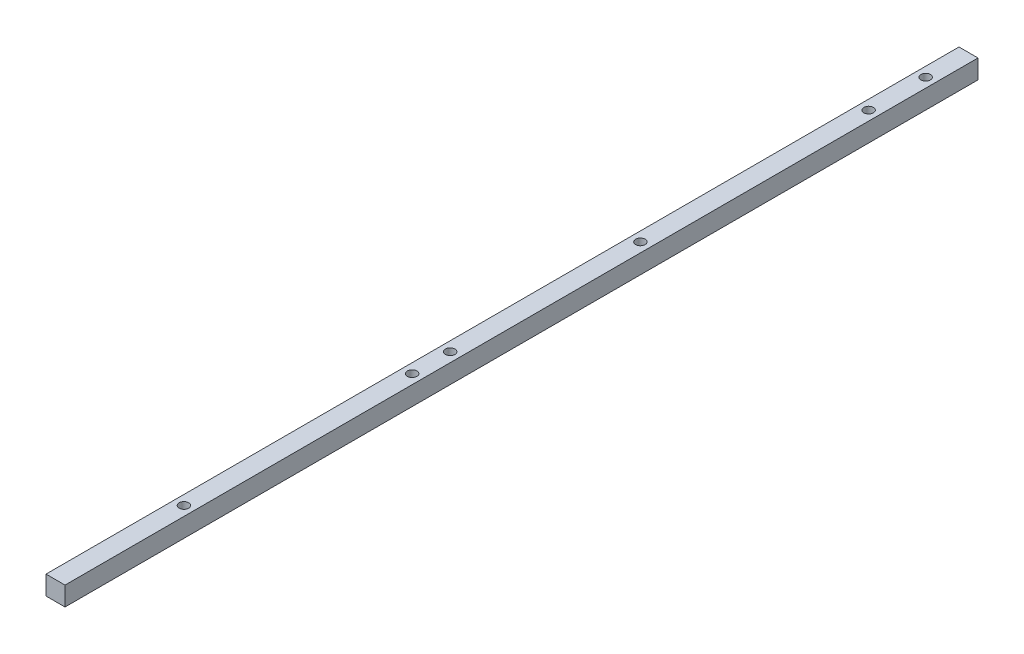
ISO-10303-21;
HEADER;
FILE_DESCRIPTION(('STEP AP214'),'2;1');
FILE_NAME('part.step','',(''),(''),'','','');
FILE_SCHEMA(('AUTOMOTIVE_DESIGN { 1 0 10303 214 1 1 1 1 }'));
ENDSEC;
DATA;
#1=APPLICATION_CONTEXT('core data for automotive mechanical design processes');
#2=APPLICATION_PROTOCOL_DEFINITION('international standard','automotive_design',2000,#1);
#3=PRODUCT_CONTEXT('',#1,'mechanical');
#4=PRODUCT('Part','Part','',(#3));
#5=PRODUCT_RELATED_PRODUCT_CATEGORY('part','',(#4));
#6=PRODUCT_DEFINITION_FORMATION('','',#4);
#7=PRODUCT_DEFINITION_CONTEXT('part definition',#1,'design');
#8=PRODUCT_DEFINITION('design','',#6,#7);
#9=PRODUCT_DEFINITION_SHAPE('','',#8);
#10=(LENGTH_UNIT() NAMED_UNIT(*) SI_UNIT(.MILLI.,.METRE.));
#11=(NAMED_UNIT(*) PLANE_ANGLE_UNIT() SI_UNIT($,.RADIAN.));
#12=(NAMED_UNIT(*) SI_UNIT($,.STERADIAN.) SOLID_ANGLE_UNIT());
#13=UNCERTAINTY_MEASURE_WITH_UNIT(LENGTH_MEASURE(1.E-05),#10,'distance_accuracy_value','');
#14=(GEOMETRIC_REPRESENTATION_CONTEXT(3) GLOBAL_UNCERTAINTY_ASSIGNED_CONTEXT((#13)) GLOBAL_UNIT_ASSIGNED_CONTEXT((#10,
#11,#12)) REPRESENTATION_CONTEXT('',''));
#15=CARTESIAN_POINT('',(0.,0.,0.));
#16=DIRECTION('',(0.,0.,1.));
#17=DIRECTION('',(1.,0.,0.));
#18=AXIS2_PLACEMENT_3D('',#15,#16,#17);
#19=CARTESIAN_POINT('',(0.,6.35,0.));
#20=DIRECTION('',(0.,-1.,0.));
#21=DIRECTION('',(0.,0.,-1.));
#22=AXIS2_PLACEMENT_3D('',#19,#20,#21);
#23=PLANE('',#22);
#24=DIRECTION('',(0.,0.,1.));
#25=VECTOR('',#24,1.);
#26=CARTESIAN_POINT('',(0.,6.35,0.));
#27=LINE('',#26,#25);
#28=CARTESIAN_POINT('',(0.,6.35,-304.8));
#29=VERTEX_POINT('',#28);
#30=CARTESIAN_POINT('',(0.,6.35,0.));
#31=VERTEX_POINT('',#30);
#32=EDGE_CURVE('E93',#29,#31,#27,.T.);
#33=ORIENTED_EDGE('',*,*,#32,.T.);
#34=DIRECTION('',(1.,0.,0.));
#35=VECTOR('',#34,1.);
#36=CARTESIAN_POINT('',(0.,6.35,0.));
#37=LINE('',#36,#35);
#38=CARTESIAN_POINT('',(6.35,6.35,0.));
#39=VERTEX_POINT('',#38);
#40=EDGE_CURVE('E88',#31,#39,#37,.T.);
#41=ORIENTED_EDGE('',*,*,#40,.T.);
#42=DIRECTION('',(0.,0.,-1.));
#43=VECTOR('',#42,1.);
#44=CARTESIAN_POINT('',(6.35,6.35,0.));
#45=LINE('',#44,#43);
#46=CARTESIAN_POINT('',(6.35,6.35,-304.8));
#47=VERTEX_POINT('',#46);
#48=EDGE_CURVE('E90',#39,#47,#45,.T.);
#49=ORIENTED_EDGE('',*,*,#48,.T.);
#50=DIRECTION('',(-1.,0.,0.));
#51=VECTOR('',#50,1.);
#52=CARTESIAN_POINT('',(0.,6.35,-304.8));
#53=LINE('',#52,#51);
#54=EDGE_CURVE('E57',#47,#29,#53,.T.);
#55=ORIENTED_EDGE('',*,*,#54,.T.);
#56=EDGE_LOOP('',(#33,#41,#49,#55));
#57=FACE_BOUND('',#56,.T.);
#58=CARTESIAN_POINT('',(3.175,6.35,-271.4625));
#59=DIRECTION('',(0.,1.,0.));
#60=DIRECTION('',(0.,0.,1.));
#61=AXIS2_PLACEMENT_3D('',#58,#59,#60);
#62=CIRCLE('',#61,1.5875);
#63=CARTESIAN_POINT('',(3.175,6.35,-269.875));
#64=VERTEX_POINT('',#63);
#65=EDGE_CURVE('E106',#64,#64,#62,.T.);
#66=ORIENTED_EDGE('',*,*,#65,.F.);
#67=EDGE_LOOP('',(#66));
#68=FACE_BOUND('',#67,.T.);
#69=CARTESIAN_POINT('',(3.175,6.35,-290.5125));
#70=DIRECTION('',(0.,1.,0.));
#71=DIRECTION('',(0.,0.,1.));
#72=AXIS2_PLACEMENT_3D('',#69,#70,#71);
#73=CIRCLE('',#72,1.5875);
#74=CARTESIAN_POINT('',(3.175,6.35,-288.925));
#75=VERTEX_POINT('',#74);
#76=EDGE_CURVE('E123',#75,#75,#73,.T.);
#77=ORIENTED_EDGE('',*,*,#76,.F.);
#78=EDGE_LOOP('',(#77));
#79=FACE_BOUND('',#78,.T.);
#80=CARTESIAN_POINT('',(3.175,6.35,-195.2625));
#81=DIRECTION('',(0.,1.,0.));
#82=DIRECTION('',(0.,0.,1.));
#83=AXIS2_PLACEMENT_3D('',#80,#81,#82);
#84=CIRCLE('',#83,1.5875);
#85=CARTESIAN_POINT('',(3.175,6.35,-193.675));
#86=VERTEX_POINT('',#85);
#87=EDGE_CURVE('E130',#86,#86,#84,.T.);
#88=ORIENTED_EDGE('',*,*,#87,.F.);
#89=EDGE_LOOP('',(#88));
#90=FACE_BOUND('',#89,.T.);
#91=CARTESIAN_POINT('',(3.175,6.35,-119.0625));
#92=DIRECTION('',(0.,1.,0.));
#93=DIRECTION('',(0.,0.,1.));
#94=AXIS2_PLACEMENT_3D('',#91,#92,#93);
#95=CIRCLE('',#94,1.5875);
#96=CARTESIAN_POINT('',(3.175,6.35,-117.475));
#97=VERTEX_POINT('',#96);
#98=EDGE_CURVE('E134',#97,#97,#95,.T.);
#99=ORIENTED_EDGE('',*,*,#98,.F.);
#100=EDGE_LOOP('',(#99));
#101=FACE_BOUND('',#100,.T.);
#102=CARTESIAN_POINT('',(3.175,6.35,-42.8625));
#103=DIRECTION('',(0.,1.,0.));
#104=DIRECTION('',(0.,0.,1.));
#105=AXIS2_PLACEMENT_3D('',#102,#103,#104);
#106=CIRCLE('',#105,1.5875);
#107=CARTESIAN_POINT('',(3.175,6.35,-41.275));
#108=VERTEX_POINT('',#107);
#109=EDGE_CURVE('E140',#108,#108,#106,.T.);
#110=ORIENTED_EDGE('',*,*,#109,.F.);
#111=EDGE_LOOP('',(#110));
#112=FACE_BOUND('',#111,.T.);
#113=CARTESIAN_POINT('',(3.175,6.35,-131.7625));
#114=DIRECTION('',(0.,1.,0.));
#115=DIRECTION('',(0.,0.,1.));
#116=AXIS2_PLACEMENT_3D('',#113,#114,#115);
#117=CIRCLE('',#116,1.5875);
#118=CARTESIAN_POINT('',(3.175,6.35,-130.175));
#119=VERTEX_POINT('',#118);
#120=EDGE_CURVE('E144',#119,#119,#117,.T.);
#121=ORIENTED_EDGE('',*,*,#120,.F.);
#122=EDGE_LOOP('',(#121));
#123=FACE_BOUND('',#122,.T.);
#124=ADVANCED_FACE('F39',(#57,#68,#79,#90,#101,#112,#123),#23,.F.);
#125=CARTESIAN_POINT('',(0.,0.,0.));
#126=DIRECTION('',(0.,-1.,0.));
#127=DIRECTION('',(0.,0.,-1.));
#128=AXIS2_PLACEMENT_3D('',#125,#126,#127);
#129=PLANE('',#128);
#130=CARTESIAN_POINT('',(3.175,0.,-42.8625));
#131=DIRECTION('',(0.,1.,0.));
#132=DIRECTION('',(0.,0.,1.));
#133=AXIS2_PLACEMENT_3D('',#130,#131,#132);
#134=CIRCLE('',#133,1.5875);
#135=CARTESIAN_POINT('',(3.175,0.,-41.275));
#136=VERTEX_POINT('',#135);
#137=EDGE_CURVE('E142',#136,#136,#134,.T.);
#138=ORIENTED_EDGE('',*,*,#137,.T.);
#139=EDGE_LOOP('',(#138));
#140=FACE_BOUND('',#139,.T.);
#141=CARTESIAN_POINT('',(3.175,0.,-195.2625));
#142=DIRECTION('',(0.,1.,0.));
#143=DIRECTION('',(0.,0.,1.));
#144=AXIS2_PLACEMENT_3D('',#141,#142,#143);
#145=CIRCLE('',#144,1.5875);
#146=CARTESIAN_POINT('',(3.175,0.,-193.675));
#147=VERTEX_POINT('',#146);
#148=EDGE_CURVE('E128',#147,#147,#145,.T.);
#149=ORIENTED_EDGE('',*,*,#148,.T.);
#150=EDGE_LOOP('',(#149));
#151=FACE_BOUND('',#150,.T.);
#152=CARTESIAN_POINT('',(3.175,0.,-271.4625));
#153=DIRECTION('',(0.,1.,0.));
#154=DIRECTION('',(0.,0.,1.));
#155=AXIS2_PLACEMENT_3D('',#152,#153,#154);
#156=CIRCLE('',#155,1.5875);
#157=CARTESIAN_POINT('',(3.175,0.,-269.875));
#158=VERTEX_POINT('',#157);
#159=EDGE_CURVE('E119',#158,#158,#156,.T.);
#160=ORIENTED_EDGE('',*,*,#159,.T.);
#161=EDGE_LOOP('',(#160));
#162=FACE_BOUND('',#161,.T.);
#163=DIRECTION('',(0.,0.,1.));
#164=VECTOR('',#163,1.);
#165=CARTESIAN_POINT('',(0.,0.,0.));
#166=LINE('',#165,#164);
#167=CARTESIAN_POINT('',(0.,0.,-304.8));
#168=VERTEX_POINT('',#167);
#169=CARTESIAN_POINT('',(0.,0.,0.));
#170=VERTEX_POINT('',#169);
#171=EDGE_CURVE('E103',#168,#170,#166,.T.);
#172=ORIENTED_EDGE('',*,*,#171,.F.);
#173=DIRECTION('',(-1.,0.,0.));
#174=VECTOR('',#173,1.);
#175=CARTESIAN_POINT('',(0.,0.,-304.8));
#176=LINE('',#175,#174);
#177=CARTESIAN_POINT('',(6.35,0.,-304.8));
#178=VERTEX_POINT('',#177);
#179=EDGE_CURVE('E76',#178,#168,#176,.T.);
#180=ORIENTED_EDGE('',*,*,#179,.F.);
#181=DIRECTION('',(0.,0.,-1.));
#182=VECTOR('',#181,1.);
#183=CARTESIAN_POINT('',(6.35,0.,0.));
#184=LINE('',#183,#182);
#185=CARTESIAN_POINT('',(6.35,0.,0.));
#186=VERTEX_POINT('',#185);
#187=EDGE_CURVE('E71',#186,#178,#184,.T.);
#188=ORIENTED_EDGE('',*,*,#187,.F.);
#189=DIRECTION('',(1.,0.,0.));
#190=VECTOR('',#189,1.);
#191=CARTESIAN_POINT('',(0.,0.,0.));
#192=LINE('',#191,#190);
#193=EDGE_CURVE('E92',#170,#186,#192,.T.);
#194=ORIENTED_EDGE('',*,*,#193,.F.);
#195=EDGE_LOOP('',(#172,#180,#188,#194));
#196=FACE_BOUND('',#195,.T.);
#197=CARTESIAN_POINT('',(3.175,0.,-290.5125));
#198=DIRECTION('',(0.,1.,0.));
#199=DIRECTION('',(0.,0.,1.));
#200=AXIS2_PLACEMENT_3D('',#197,#198,#199);
#201=CIRCLE('',#200,1.5875);
#202=CARTESIAN_POINT('',(3.175,0.,-288.925));
#203=VERTEX_POINT('',#202);
#204=EDGE_CURVE('E125',#203,#203,#201,.T.);
#205=ORIENTED_EDGE('',*,*,#204,.T.);
#206=EDGE_LOOP('',(#205));
#207=FACE_BOUND('',#206,.T.);
#208=CARTESIAN_POINT('',(3.175,0.,-119.0625));
#209=DIRECTION('',(0.,1.,0.));
#210=DIRECTION('',(0.,0.,1.));
#211=AXIS2_PLACEMENT_3D('',#208,#209,#210);
#212=CIRCLE('',#211,1.5875);
#213=CARTESIAN_POINT('',(3.175,0.,-117.475));
#214=VERTEX_POINT('',#213);
#215=EDGE_CURVE('E138',#214,#214,#212,.T.);
#216=ORIENTED_EDGE('',*,*,#215,.T.);
#217=EDGE_LOOP('',(#216));
#218=FACE_BOUND('',#217,.T.);
#219=CARTESIAN_POINT('',(3.175,0.,-131.7625));
#220=DIRECTION('',(0.,1.,0.));
#221=DIRECTION('',(0.,0.,1.));
#222=AXIS2_PLACEMENT_3D('',#219,#220,#221);
#223=CIRCLE('',#222,1.5875);
#224=CARTESIAN_POINT('',(3.175,0.,-130.175));
#225=VERTEX_POINT('',#224);
#226=EDGE_CURVE('E146',#225,#225,#223,.T.);
#227=ORIENTED_EDGE('',*,*,#226,.T.);
#228=EDGE_LOOP('',(#227));
#229=FACE_BOUND('',#228,.T.);
#230=ADVANCED_FACE('F111',(#140,#151,#162,#196,#207,#218,#229),#129,.T.);
#231=CARTESIAN_POINT('',(0.,6.35,0.));
#232=DIRECTION('',(1.,0.,0.));
#233=DIRECTION('',(0.,0.,-1.));
#234=AXIS2_PLACEMENT_3D('',#231,#232,#233);
#235=PLANE('',#234);
#236=ORIENTED_EDGE('',*,*,#171,.T.);
#237=DIRECTION('',(0.,-1.,0.));
#238=VECTOR('',#237,1.);
#239=CARTESIAN_POINT('',(0.,6.35,0.));
#240=LINE('',#239,#238);
#241=EDGE_CURVE('E11',#31,#170,#240,.T.);
#242=ORIENTED_EDGE('',*,*,#241,.F.);
#243=ORIENTED_EDGE('',*,*,#32,.F.);
#244=DIRECTION('',(0.,-1.,0.));
#245=VECTOR('',#244,1.);
#246=CARTESIAN_POINT('',(0.,6.35,-304.8));
#247=LINE('',#246,#245);
#248=EDGE_CURVE('E97',#29,#168,#247,.T.);
#249=ORIENTED_EDGE('',*,*,#248,.T.);
#250=EDGE_LOOP('',(#236,#242,#243,#249));
#251=FACE_BOUND('',#250,.T.);
#252=ADVANCED_FACE('F41',(#251),#235,.F.);
#253=CARTESIAN_POINT('',(0.,6.35,0.));
#254=DIRECTION('',(0.,0.,-1.));
#255=DIRECTION('',(-1.,0.,0.));
#256=AXIS2_PLACEMENT_3D('',#253,#254,#255);
#257=PLANE('',#256);
#258=ORIENTED_EDGE('',*,*,#193,.T.);
#259=DIRECTION('',(0.,-1.,0.));
#260=VECTOR('',#259,1.);
#261=CARTESIAN_POINT('',(6.35,6.35,0.));
#262=LINE('',#261,#260);
#263=EDGE_CURVE('E48',#39,#186,#262,.T.);
#264=ORIENTED_EDGE('',*,*,#263,.F.);
#265=ORIENTED_EDGE('',*,*,#40,.F.);
#266=ORIENTED_EDGE('',*,*,#241,.T.);
#267=EDGE_LOOP('',(#258,#264,#265,#266));
#268=FACE_BOUND('',#267,.T.);
#269=ADVANCED_FACE('F94',(#268),#257,.F.);
#270=CARTESIAN_POINT('',(6.35,6.35,0.));
#271=DIRECTION('',(-1.,0.,0.));
#272=DIRECTION('',(0.,0.,1.));
#273=AXIS2_PLACEMENT_3D('',#270,#271,#272);
#274=PLANE('',#273);
#275=ORIENTED_EDGE('',*,*,#187,.T.);
#276=DIRECTION('',(0.,-1.,0.));
#277=VECTOR('',#276,1.);
#278=CARTESIAN_POINT('',(6.35,6.35,-304.8));
#279=LINE('',#278,#277);
#280=EDGE_CURVE('E96',#47,#178,#279,.T.);
#281=ORIENTED_EDGE('',*,*,#280,.F.);
#282=ORIENTED_EDGE('',*,*,#48,.F.);
#283=ORIENTED_EDGE('',*,*,#263,.T.);
#284=EDGE_LOOP('',(#275,#281,#282,#283));
#285=FACE_BOUND('',#284,.T.);
#286=ADVANCED_FACE('F100',(#285),#274,.F.);
#287=CARTESIAN_POINT('',(0.,6.35,-304.8));
#288=DIRECTION('',(0.,0.,1.));
#289=DIRECTION('',(1.,0.,0.));
#290=AXIS2_PLACEMENT_3D('',#287,#288,#289);
#291=PLANE('',#290);
#292=ORIENTED_EDGE('',*,*,#179,.T.);
#293=ORIENTED_EDGE('',*,*,#248,.F.);
#294=ORIENTED_EDGE('',*,*,#54,.F.);
#295=ORIENTED_EDGE('',*,*,#280,.T.);
#296=EDGE_LOOP('',(#292,#293,#294,#295));
#297=FACE_BOUND('',#296,.T.);
#298=ADVANCED_FACE('F112',(#297),#291,.F.);
#299=CARTESIAN_POINT('',(3.175,6.35,-271.4625));
#300=DIRECTION('',(0.,-1.,0.));
#301=DIRECTION('',(0.,0.,-1.));
#302=AXIS2_PLACEMENT_3D('',#299,#300,#301);
#303=CYLINDRICAL_SURFACE('',#302,1.5875);
#304=ORIENTED_EDGE('',*,*,#65,.T.);
#305=EDGE_LOOP('',(#304));
#306=FACE_BOUND('',#305,.T.);
#307=ORIENTED_EDGE('',*,*,#159,.F.);
#308=EDGE_LOOP('',(#307));
#309=FACE_BOUND('',#308,.T.);
#310=ADVANCED_FACE('F164',(#306,#309),#303,.F.);
#311=CARTESIAN_POINT('',(3.175,6.35,-290.5125));
#312=DIRECTION('',(0.,-1.,0.));
#313=DIRECTION('',(0.,0.,-1.));
#314=AXIS2_PLACEMENT_3D('',#311,#312,#313);
#315=CYLINDRICAL_SURFACE('',#314,1.5875);
#316=ORIENTED_EDGE('',*,*,#76,.T.);
#317=EDGE_LOOP('',(#316));
#318=FACE_BOUND('',#317,.T.);
#319=ORIENTED_EDGE('',*,*,#204,.F.);
#320=EDGE_LOOP('',(#319));
#321=FACE_BOUND('',#320,.T.);
#322=ADVANCED_FACE('F209',(#318,#321),#315,.F.);
#323=CARTESIAN_POINT('',(3.175,6.35,-195.2625));
#324=DIRECTION('',(0.,-1.,0.));
#325=DIRECTION('',(0.,0.,-1.));
#326=AXIS2_PLACEMENT_3D('',#323,#324,#325);
#327=CYLINDRICAL_SURFACE('',#326,1.5875);
#328=ORIENTED_EDGE('',*,*,#87,.T.);
#329=EDGE_LOOP('',(#328));
#330=FACE_BOUND('',#329,.T.);
#331=ORIENTED_EDGE('',*,*,#148,.F.);
#332=EDGE_LOOP('',(#331));
#333=FACE_BOUND('',#332,.T.);
#334=ADVANCED_FACE('F217',(#330,#333),#327,.F.);
#335=CARTESIAN_POINT('',(3.175,6.35,-119.0625));
#336=DIRECTION('',(0.,-1.,0.));
#337=DIRECTION('',(0.,0.,-1.));
#338=AXIS2_PLACEMENT_3D('',#335,#336,#337);
#339=CYLINDRICAL_SURFACE('',#338,1.5875);
#340=ORIENTED_EDGE('',*,*,#98,.T.);
#341=EDGE_LOOP('',(#340));
#342=FACE_BOUND('',#341,.T.);
#343=ORIENTED_EDGE('',*,*,#215,.F.);
#344=EDGE_LOOP('',(#343));
#345=FACE_BOUND('',#344,.T.);
#346=ADVANCED_FACE('F227',(#342,#345),#339,.F.);
#347=CARTESIAN_POINT('',(3.175,6.35,-42.8625));
#348=DIRECTION('',(0.,-1.,0.));
#349=DIRECTION('',(0.,0.,-1.));
#350=AXIS2_PLACEMENT_3D('',#347,#348,#349);
#351=CYLINDRICAL_SURFACE('',#350,1.5875);
#352=ORIENTED_EDGE('',*,*,#109,.T.);
#353=EDGE_LOOP('',(#352));
#354=FACE_BOUND('',#353,.T.);
#355=ORIENTED_EDGE('',*,*,#137,.F.);
#356=EDGE_LOOP('',(#355));
#357=FACE_BOUND('',#356,.T.);
#358=ADVANCED_FACE('F231',(#354,#357),#351,.F.);
#359=CARTESIAN_POINT('',(3.175,6.35,-131.7625));
#360=DIRECTION('',(0.,-1.,0.));
#361=DIRECTION('',(0.,0.,-1.));
#362=AXIS2_PLACEMENT_3D('',#359,#360,#361);
#363=CYLINDRICAL_SURFACE('',#362,1.5875);
#364=ORIENTED_EDGE('',*,*,#120,.T.);
#365=EDGE_LOOP('',(#364));
#366=FACE_BOUND('',#365,.T.);
#367=ORIENTED_EDGE('',*,*,#226,.F.);
#368=EDGE_LOOP('',(#367));
#369=FACE_BOUND('',#368,.T.);
#370=ADVANCED_FACE('F152',(#366,#369),#363,.F.);
#371=CLOSED_SHELL('',(#124,#230,#252,#269,#286,#298,#310,#322,#334,#346,#358,#370));
#372=MANIFOLD_SOLID_BREP('B2',#371);
#373=ADVANCED_BREP_SHAPE_REPRESENTATION('',(#18,#372),#14);
#374=SHAPE_DEFINITION_REPRESENTATION(#9,#373);
ENDSEC;
END-ISO-10303-21;
